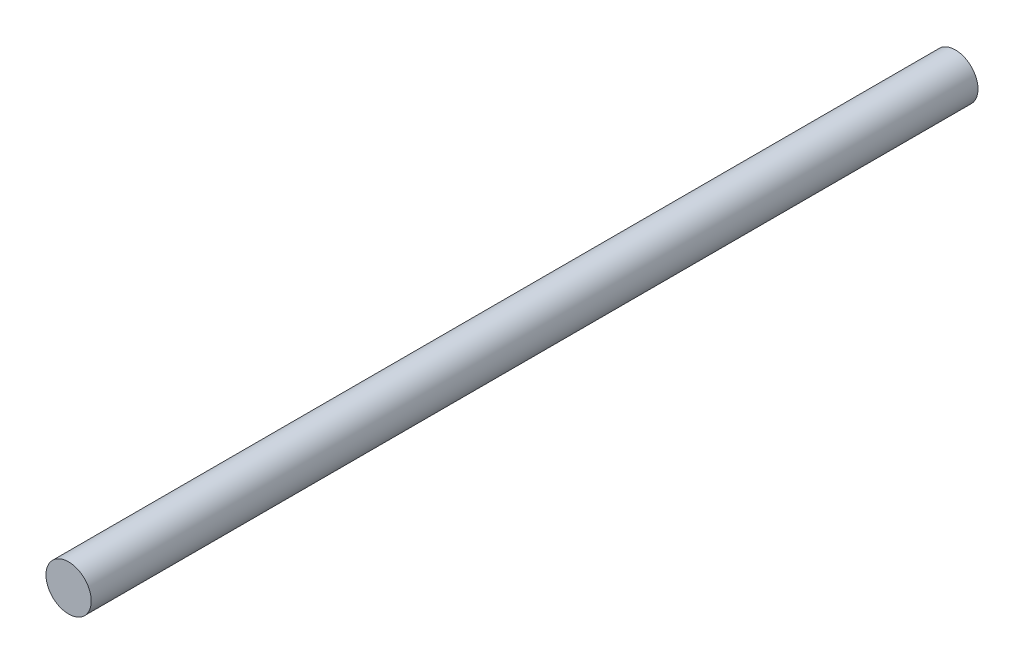
ISO-10303-21;
HEADER;
FILE_DESCRIPTION(('STEP AP214'),'2;1');
FILE_NAME('part.step','',(''),(''),'','','');
FILE_SCHEMA(('AUTOMOTIVE_DESIGN { 1 0 10303 214 1 1 1 1 }'));
ENDSEC;
DATA;
#1=APPLICATION_CONTEXT('core data for automotive mechanical design processes');
#2=APPLICATION_PROTOCOL_DEFINITION('international standard','automotive_design',2000,#1);
#3=PRODUCT_CONTEXT('',#1,'mechanical');
#4=PRODUCT('Part','Part','',(#3));
#5=PRODUCT_RELATED_PRODUCT_CATEGORY('part','',(#4));
#6=PRODUCT_DEFINITION_FORMATION('','',#4);
#7=PRODUCT_DEFINITION_CONTEXT('part definition',#1,'design');
#8=PRODUCT_DEFINITION('design','',#6,#7);
#9=PRODUCT_DEFINITION_SHAPE('','',#8);
#10=(LENGTH_UNIT() NAMED_UNIT(*) SI_UNIT(.MILLI.,.METRE.));
#11=(NAMED_UNIT(*) PLANE_ANGLE_UNIT() SI_UNIT($,.RADIAN.));
#12=(NAMED_UNIT(*) SI_UNIT($,.STERADIAN.) SOLID_ANGLE_UNIT());
#13=UNCERTAINTY_MEASURE_WITH_UNIT(LENGTH_MEASURE(1.E-05),#10,'distance_accuracy_value','');
#14=(GEOMETRIC_REPRESENTATION_CONTEXT(3) GLOBAL_UNCERTAINTY_ASSIGNED_CONTEXT((#13)) GLOBAL_UNIT_ASSIGNED_CONTEXT((#10,
#11,#12)) REPRESENTATION_CONTEXT('',''));
#15=CARTESIAN_POINT('',(0.,0.,0.));
#16=DIRECTION('',(0.,0.,1.));
#17=DIRECTION('',(1.,0.,0.));
#18=AXIS2_PLACEMENT_3D('',#15,#16,#17);
#19=CARTESIAN_POINT('',(0.,0.,76.));
#20=DIRECTION('',(0.,0.,-1.));
#21=DIRECTION('',(-1.,0.,0.));
#22=AXIS2_PLACEMENT_3D('',#19,#20,#21);
#23=CYLINDRICAL_SURFACE('',#22,1.94);
#24=CARTESIAN_POINT('',(0.,0.,76.));
#25=DIRECTION('',(0.,0.,1.));
#26=DIRECTION('',(1.,0.,0.));
#27=AXIS2_PLACEMENT_3D('',#24,#25,#26);
#28=CIRCLE('',#27,1.94);
#29=CARTESIAN_POINT('',(1.94,0.,76.));
#30=VERTEX_POINT('',#29);
#31=EDGE_CURVE('E10',#30,#30,#28,.T.);
#32=ORIENTED_EDGE('',*,*,#31,.F.);
#33=EDGE_LOOP('',(#32));
#34=FACE_BOUND('',#33,.T.);
#35=CARTESIAN_POINT('',(0.,0.,0.));
#36=DIRECTION('',(0.,0.,1.));
#37=DIRECTION('',(1.,0.,0.));
#38=AXIS2_PLACEMENT_3D('',#35,#36,#37);
#39=CIRCLE('',#38,1.94);
#40=CARTESIAN_POINT('',(1.94,0.,0.));
#41=VERTEX_POINT('',#40);
#42=EDGE_CURVE('E42',#41,#41,#39,.T.);
#43=ORIENTED_EDGE('',*,*,#42,.T.);
#44=EDGE_LOOP('',(#43));
#45=FACE_BOUND('',#44,.T.);
#46=ADVANCED_FACE('F39',(#34,#45),#23,.T.);
#47=CARTESIAN_POINT('',(0.,0.,76.));
#48=DIRECTION('',(0.,0.,1.));
#49=DIRECTION('',(1.,0.,0.));
#50=AXIS2_PLACEMENT_3D('',#47,#48,#49);
#51=PLANE('',#50);
#52=ORIENTED_EDGE('',*,*,#31,.T.);
#53=EDGE_LOOP('',(#52));
#54=FACE_BOUND('',#53,.T.);
#55=ADVANCED_FACE('F54',(#54),#51,.T.);
#56=CARTESIAN_POINT('',(0.,0.,0.));
#57=DIRECTION('',(0.,0.,1.));
#58=DIRECTION('',(1.,0.,0.));
#59=AXIS2_PLACEMENT_3D('',#56,#57,#58);
#60=PLANE('',#59);
#61=ORIENTED_EDGE('',*,*,#42,.F.);
#62=EDGE_LOOP('',(#61));
#63=FACE_BOUND('',#62,.T.);
#64=ADVANCED_FACE('F52',(#63),#60,.F.);
#65=CLOSED_SHELL('',(#46,#55,#64));
#66=MANIFOLD_SOLID_BREP('B2',#65);
#67=ADVANCED_BREP_SHAPE_REPRESENTATION('',(#18,#66),#14);
#68=SHAPE_DEFINITION_REPRESENTATION(#9,#67);
ENDSEC;
END-ISO-10303-21;
